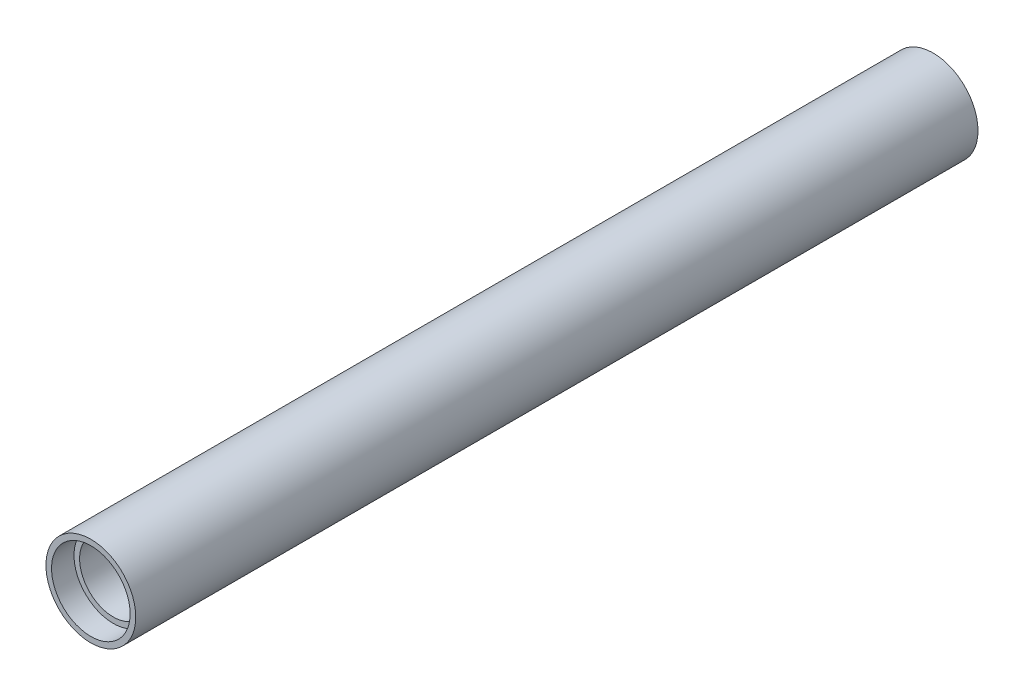
ISO-10303-21;
HEADER;
FILE_DESCRIPTION(('STEP AP214'),'2;1');
FILE_NAME('part.step','',(''),(''),'','','');
FILE_SCHEMA(('AUTOMOTIVE_DESIGN { 1 0 10303 214 1 1 1 1 }'));
ENDSEC;
DATA;
#1=APPLICATION_CONTEXT('core data for automotive mechanical design processes');
#2=APPLICATION_PROTOCOL_DEFINITION('international standard','automotive_design',2000,#1);
#3=PRODUCT_CONTEXT('',#1,'mechanical');
#4=PRODUCT('Part','Part','',(#3));
#5=PRODUCT_RELATED_PRODUCT_CATEGORY('part','',(#4));
#6=PRODUCT_DEFINITION_FORMATION('','',#4);
#7=PRODUCT_DEFINITION_CONTEXT('part definition',#1,'design');
#8=PRODUCT_DEFINITION('design','',#6,#7);
#9=PRODUCT_DEFINITION_SHAPE('','',#8);
#10=(LENGTH_UNIT() NAMED_UNIT(*) SI_UNIT(.MILLI.,.METRE.));
#11=(NAMED_UNIT(*) PLANE_ANGLE_UNIT() SI_UNIT($,.RADIAN.));
#12=(NAMED_UNIT(*) SI_UNIT($,.STERADIAN.) SOLID_ANGLE_UNIT());
#13=UNCERTAINTY_MEASURE_WITH_UNIT(LENGTH_MEASURE(1.E-05),#10,'distance_accuracy_value','');
#14=(GEOMETRIC_REPRESENTATION_CONTEXT(3) GLOBAL_UNCERTAINTY_ASSIGNED_CONTEXT((#13)) GLOBAL_UNIT_ASSIGNED_CONTEXT((#10,
#11,#12)) REPRESENTATION_CONTEXT('',''));
#15=CARTESIAN_POINT('',(0.,0.,0.));
#16=DIRECTION('',(0.,0.,1.));
#17=DIRECTION('',(1.,0.,0.));
#18=AXIS2_PLACEMENT_3D('',#15,#16,#17);
#19=CARTESIAN_POINT('',(0.,0.,225.));
#20=DIRECTION('',(0.,0.,-1.));
#21=DIRECTION('',(-1.,0.,0.));
#22=AXIS2_PLACEMENT_3D('',#19,#20,#21);
#23=CYLINDRICAL_SURFACE('',#22,21.);
#24=CARTESIAN_POINT('',(0.,0.,-225.));
#25=DIRECTION('',(0.,0.,1.));
#26=DIRECTION('',(1.,0.,0.));
#27=AXIS2_PLACEMENT_3D('',#24,#25,#26);
#28=CIRCLE('',#27,21.);
#29=CARTESIAN_POINT('',(21.,0.,-225.));
#30=VERTEX_POINT('',#29);
#31=EDGE_CURVE('E75',#30,#30,#28,.T.);
#32=ORIENTED_EDGE('',*,*,#31,.F.);
#33=EDGE_LOOP('',(#32));
#34=FACE_BOUND('',#33,.T.);
#35=CARTESIAN_POINT('',(0.,0.,-213.));
#36=DIRECTION('',(0.,0.,1.));
#37=DIRECTION('',(1.,0.,0.));
#38=AXIS2_PLACEMENT_3D('',#35,#36,#37);
#39=CIRCLE('',#38,21.);
#40=CARTESIAN_POINT('',(21.,0.,-213.));
#41=VERTEX_POINT('',#40);
#42=EDGE_CURVE('E83',#41,#41,#39,.T.);
#43=ORIENTED_EDGE('',*,*,#42,.T.);
#44=EDGE_LOOP('',(#43));
#45=FACE_BOUND('',#44,.T.);
#46=ADVANCED_FACE('F57',(#34,#45),#23,.F.);
#47=CARTESIAN_POINT('',(0.,0.,225.));
#48=DIRECTION('',(0.,0.,1.));
#49=DIRECTION('',(1.,0.,0.));
#50=AXIS2_PLACEMENT_3D('',#47,#48,#49);
#51=PLANE('',#50);
#52=CARTESIAN_POINT('',(0.,0.,225.));
#53=DIRECTION('',(0.,0.,1.));
#54=DIRECTION('',(1.,0.,0.));
#55=AXIS2_PLACEMENT_3D('',#52,#53,#54);
#56=CIRCLE('',#55,24.);
#57=CARTESIAN_POINT('',(24.,0.,225.));
#58=VERTEX_POINT('',#57);
#59=EDGE_CURVE('E64',#58,#58,#56,.T.);
#60=ORIENTED_EDGE('',*,*,#59,.T.);
#61=EDGE_LOOP('',(#60));
#62=FACE_BOUND('',#61,.T.);
#63=CARTESIAN_POINT('',(0.,0.,225.));
#64=DIRECTION('',(0.,0.,1.));
#65=DIRECTION('',(1.,0.,0.));
#66=AXIS2_PLACEMENT_3D('',#63,#64,#65);
#67=CIRCLE('',#66,21.);
#68=CARTESIAN_POINT('',(21.,0.,225.));
#69=VERTEX_POINT('',#68);
#70=EDGE_CURVE('E73',#69,#69,#67,.T.);
#71=ORIENTED_EDGE('',*,*,#70,.F.);
#72=EDGE_LOOP('',(#71));
#73=FACE_BOUND('',#72,.T.);
#74=ADVANCED_FACE('F107',(#62,#73),#51,.T.);
#75=CARTESIAN_POINT('',(0.,0.,-225.));
#76=DIRECTION('',(0.,0.,1.));
#77=DIRECTION('',(1.,0.,0.));
#78=AXIS2_PLACEMENT_3D('',#75,#76,#77);
#79=PLANE('',#78);
#80=CARTESIAN_POINT('',(0.,0.,-225.));
#81=DIRECTION('',(0.,0.,1.));
#82=DIRECTION('',(1.,0.,0.));
#83=AXIS2_PLACEMENT_3D('',#80,#81,#82);
#84=CIRCLE('',#83,24.);
#85=CARTESIAN_POINT('',(24.,0.,-225.));
#86=VERTEX_POINT('',#85);
#87=EDGE_CURVE('E68',#86,#86,#84,.T.);
#88=ORIENTED_EDGE('',*,*,#87,.F.);
#89=EDGE_LOOP('',(#88));
#90=FACE_BOUND('',#89,.T.);
#91=ORIENTED_EDGE('',*,*,#31,.T.);
#92=EDGE_LOOP('',(#91));
#93=FACE_BOUND('',#92,.T.);
#94=ADVANCED_FACE('F113',(#90,#93),#79,.F.);
#95=CARTESIAN_POINT('',(0.,0.,225.));
#96=DIRECTION('',(0.,0.,-1.));
#97=DIRECTION('',(-1.,0.,0.));
#98=AXIS2_PLACEMENT_3D('',#95,#96,#97);
#99=CYLINDRICAL_SURFACE('',#98,24.);
#100=ORIENTED_EDGE('',*,*,#59,.F.);
#101=EDGE_LOOP('',(#100));
#102=FACE_BOUND('',#101,.T.);
#103=ORIENTED_EDGE('',*,*,#87,.T.);
#104=EDGE_LOOP('',(#103));
#105=FACE_BOUND('',#104,.T.);
#106=ADVANCED_FACE('F59',(#102,#105),#99,.T.);
#107=CARTESIAN_POINT('',(0.,0.,213.));
#108=DIRECTION('',(0.,0.,1.));
#109=DIRECTION('',(1.,0.,0.));
#110=AXIS2_PLACEMENT_3D('',#107,#108,#109);
#111=CIRCLE('',#110,21.);
#112=CARTESIAN_POINT('',(21.,0.,213.));
#113=VERTEX_POINT('',#112);
#114=EDGE_CURVE('E11',#113,#113,#111,.T.);
#115=ORIENTED_EDGE('',*,*,#114,.F.);
#116=EDGE_LOOP('',(#115));
#117=FACE_BOUND('',#116,.T.);
#118=ORIENTED_EDGE('',*,*,#70,.T.);
#119=EDGE_LOOP('',(#118));
#120=FACE_BOUND('',#119,.T.);
#121=ADVANCED_FACE('F104',(#117,#120),#23,.F.);
#122=CARTESIAN_POINT('',(0.,0.,213.));
#123=DIRECTION('',(0.,0.,1.));
#124=DIRECTION('',(1.,0.,0.));
#125=AXIS2_PLACEMENT_3D('',#122,#123,#124);
#126=PLANE('',#125);
#127=CARTESIAN_POINT('',(0.,0.,213.));
#128=DIRECTION('',(0.,0.,1.));
#129=DIRECTION('',(1.,0.,0.));
#130=AXIS2_PLACEMENT_3D('',#127,#128,#129);
#131=CIRCLE('',#130,18.);
#132=CARTESIAN_POINT('',(18.,0.,213.));
#133=VERTEX_POINT('',#132);
#134=EDGE_CURVE('E78',#133,#133,#131,.T.);
#135=ORIENTED_EDGE('',*,*,#134,.F.);
#136=EDGE_LOOP('',(#135));
#137=FACE_BOUND('',#136,.T.);
#138=ORIENTED_EDGE('',*,*,#114,.T.);
#139=EDGE_LOOP('',(#138));
#140=FACE_BOUND('',#139,.T.);
#141=ADVANCED_FACE('F94',(#137,#140),#126,.T.);
#142=CARTESIAN_POINT('',(0.,0.,-59.39696961967));
#143=DIRECTION('',(0.,0.,1.));
#144=DIRECTION('',(1.,0.,0.));
#145=AXIS2_PLACEMENT_3D('',#142,#143,#144);
#146=CYLINDRICAL_SURFACE('',#145,18.);
#147=ORIENTED_EDGE('',*,*,#134,.T.);
#148=EDGE_LOOP('',(#147));
#149=FACE_BOUND('',#148,.T.);
#150=CARTESIAN_POINT('',(0.,0.,-213.));
#151=DIRECTION('',(0.,0.,1.));
#152=DIRECTION('',(1.,0.,0.));
#153=AXIS2_PLACEMENT_3D('',#150,#151,#152);
#154=CIRCLE('',#153,18.);
#155=CARTESIAN_POINT('',(18.,0.,-213.));
#156=VERTEX_POINT('',#155);
#157=EDGE_CURVE('E86',#156,#156,#154,.T.);
#158=ORIENTED_EDGE('',*,*,#157,.F.);
#159=EDGE_LOOP('',(#158));
#160=FACE_BOUND('',#159,.T.);
#161=ADVANCED_FACE('F92',(#149,#160),#146,.F.);
#162=CARTESIAN_POINT('',(0.,0.,-213.));
#163=DIRECTION('',(0.,0.,1.));
#164=DIRECTION('',(1.,0.,0.));
#165=AXIS2_PLACEMENT_3D('',#162,#163,#164);
#166=PLANE('',#165);
#167=ORIENTED_EDGE('',*,*,#42,.F.);
#168=EDGE_LOOP('',(#167));
#169=FACE_BOUND('',#168,.T.);
#170=ORIENTED_EDGE('',*,*,#157,.T.);
#171=EDGE_LOOP('',(#170));
#172=FACE_BOUND('',#171,.T.);
#173=ADVANCED_FACE('F90',(#169,#172),#166,.F.);
#174=CLOSED_SHELL('',(#46,#74,#94,#106,#121,#141,#161,#173));
#175=MANIFOLD_SOLID_BREP('B2',#174);
#176=ADVANCED_BREP_SHAPE_REPRESENTATION('',(#18,#175),#14);
#177=SHAPE_DEFINITION_REPRESENTATION(#9,#176);
ENDSEC;
END-ISO-10303-21;
